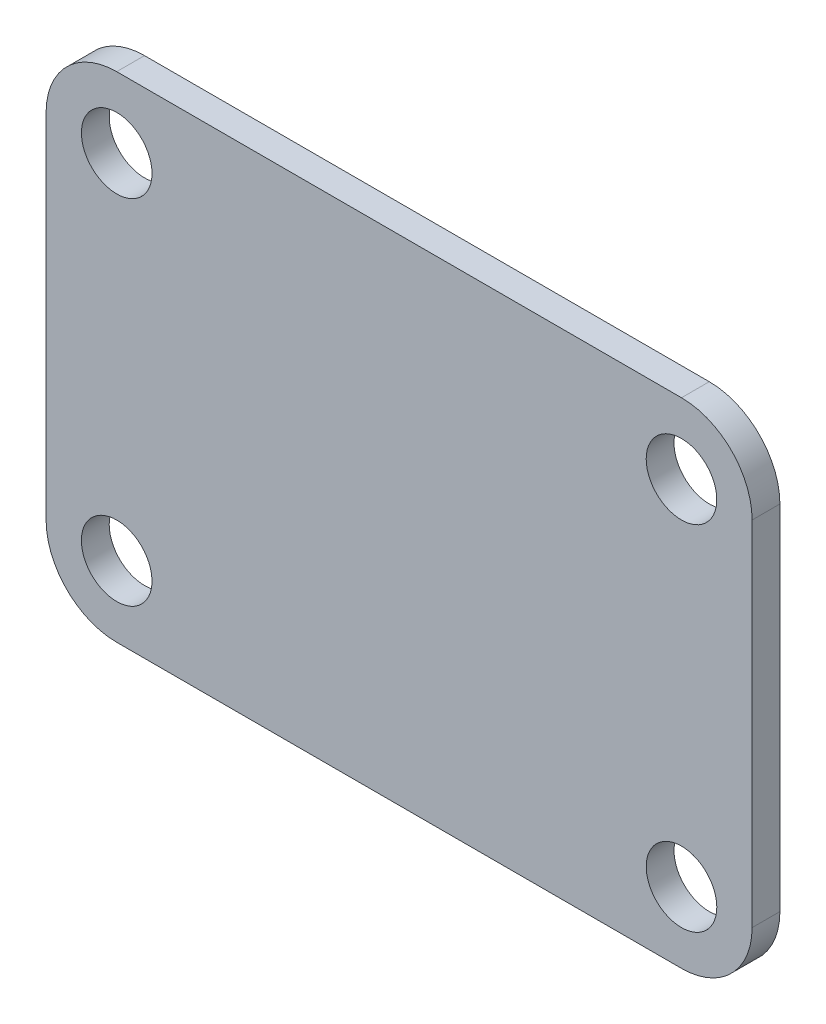
ISO-10303-21;
HEADER;
FILE_DESCRIPTION(('STEP AP214'),'2;1');
FILE_NAME('part.step','',(''),(''),'','','');
FILE_SCHEMA(('AUTOMOTIVE_DESIGN { 1 0 10303 214 1 1 1 1 }'));
ENDSEC;
DATA;
#1=APPLICATION_CONTEXT('core data for automotive mechanical design processes');
#2=APPLICATION_PROTOCOL_DEFINITION('international standard','automotive_design',2000,#1);
#3=PRODUCT_CONTEXT('',#1,'mechanical');
#4=PRODUCT('Part','Part','',(#3));
#5=PRODUCT_RELATED_PRODUCT_CATEGORY('part','',(#4));
#6=PRODUCT_DEFINITION_FORMATION('','',#4);
#7=PRODUCT_DEFINITION_CONTEXT('part definition',#1,'design');
#8=PRODUCT_DEFINITION('design','',#6,#7);
#9=PRODUCT_DEFINITION_SHAPE('','',#8);
#10=(LENGTH_UNIT() NAMED_UNIT(*) SI_UNIT(.MILLI.,.METRE.));
#11=(NAMED_UNIT(*) PLANE_ANGLE_UNIT() SI_UNIT($,.RADIAN.));
#12=(NAMED_UNIT(*) SI_UNIT($,.STERADIAN.) SOLID_ANGLE_UNIT());
#13=UNCERTAINTY_MEASURE_WITH_UNIT(LENGTH_MEASURE(1.E-05),#10,'distance_accuracy_value','');
#14=(GEOMETRIC_REPRESENTATION_CONTEXT(3) GLOBAL_UNCERTAINTY_ASSIGNED_CONTEXT((#13)) GLOBAL_UNIT_ASSIGNED_CONTEXT((#10,
#11,#12)) REPRESENTATION_CONTEXT('',''));
#15=CARTESIAN_POINT('',(0.,0.,0.));
#16=DIRECTION('',(0.,0.,1.));
#17=DIRECTION('',(1.,0.,0.));
#18=AXIS2_PLACEMENT_3D('',#15,#16,#17);
#19=CARTESIAN_POINT('',(10.16,-6.35,1.));
#20=DIRECTION('',(0.,0.,1.));
#21=DIRECTION('',(1.,0.,0.));
#22=AXIS2_PLACEMENT_3D('',#19,#20,#21);
#23=PLANE('',#22);
#24=CARTESIAN_POINT('',(10.16,-6.35,1.));
#25=DIRECTION('',(0.,0.,1.));
#26=DIRECTION('',(1.,0.,0.));
#27=AXIS2_PLACEMENT_3D('',#24,#25,#26);
#28=CIRCLE('',#27,1.27000000000001);
#29=CARTESIAN_POINT('',(11.43,-6.35,1.));
#30=VERTEX_POINT('',#29);
#31=EDGE_CURVE('E221',#30,#30,#28,.T.);
#32=ORIENTED_EDGE('',*,*,#31,.F.);
#33=EDGE_LOOP('',(#32));
#34=FACE_BOUND('',#33,.T.);
#35=CARTESIAN_POINT('',(-10.16,6.35,1.));
#36=DIRECTION('',(0.,0.,1.));
#37=DIRECTION('',(1.,0.,0.));
#38=AXIS2_PLACEMENT_3D('',#35,#36,#37);
#39=CIRCLE('',#38,1.27000000000001);
#40=CARTESIAN_POINT('',(-8.89,6.35,1.));
#41=VERTEX_POINT('',#40);
#42=EDGE_CURVE('E146',#41,#41,#39,.T.);
#43=ORIENTED_EDGE('',*,*,#42,.F.);
#44=EDGE_LOOP('',(#43));
#45=FACE_BOUND('',#44,.T.);
#46=CARTESIAN_POINT('',(10.16,-6.35,1.));
#47=DIRECTION('',(0.,0.,1.));
#48=DIRECTION('',(1.,0.,0.));
#49=AXIS2_PLACEMENT_3D('',#46,#47,#48);
#50=CIRCLE('',#49,2.54);
#51=CARTESIAN_POINT('',(10.16,-8.89,1.));
#52=VERTEX_POINT('',#51);
#53=CARTESIAN_POINT('',(12.7,-6.34999999999998,1.));
#54=VERTEX_POINT('',#53);
#55=EDGE_CURVE('E164',#52,#54,#50,.T.);
#56=ORIENTED_EDGE('',*,*,#55,.T.);
#57=DIRECTION('',(0.,1.,0.));
#58=VECTOR('',#57,1.);
#59=CARTESIAN_POINT('',(12.7,-6.34999999999998,1.));
#60=LINE('',#59,#58);
#61=CARTESIAN_POINT('',(12.7,6.34999999999998,1.));
#62=VERTEX_POINT('',#61);
#63=EDGE_CURVE('E100',#54,#62,#60,.T.);
#64=ORIENTED_EDGE('',*,*,#63,.T.);
#65=CARTESIAN_POINT('',(10.16,6.35,1.));
#66=DIRECTION('',(0.,0.,1.));
#67=DIRECTION('',(1.,0.,0.));
#68=AXIS2_PLACEMENT_3D('',#65,#66,#67);
#69=CIRCLE('',#68,2.54);
#70=CARTESIAN_POINT('',(10.16,8.89,1.));
#71=VERTEX_POINT('',#70);
#72=EDGE_CURVE('E185',#62,#71,#69,.T.);
#73=ORIENTED_EDGE('',*,*,#72,.T.);
#74=DIRECTION('',(-1.,0.,0.));
#75=VECTOR('',#74,1.);
#76=CARTESIAN_POINT('',(10.16,8.89,1.));
#77=LINE('',#76,#75);
#78=CARTESIAN_POINT('',(-10.16,8.89,1.));
#79=VERTEX_POINT('',#78);
#80=EDGE_CURVE('E199',#71,#79,#77,.T.);
#81=ORIENTED_EDGE('',*,*,#80,.T.);
#82=CARTESIAN_POINT('',(-10.16,6.35,1.));
#83=DIRECTION('',(0.,0.,1.));
#84=DIRECTION('',(1.,0.,0.));
#85=AXIS2_PLACEMENT_3D('',#82,#83,#84);
#86=CIRCLE('',#85,2.54);
#87=CARTESIAN_POINT('',(-12.7,6.34999999999998,1.));
#88=VERTEX_POINT('',#87);
#89=EDGE_CURVE('E119',#79,#88,#86,.T.);
#90=ORIENTED_EDGE('',*,*,#89,.T.);
#91=DIRECTION('',(0.,-1.,0.));
#92=VECTOR('',#91,1.);
#93=CARTESIAN_POINT('',(-12.7,-6.34999999999998,1.));
#94=LINE('',#93,#92);
#95=CARTESIAN_POINT('',(-12.7,-6.35,1.));
#96=VERTEX_POINT('',#95);
#97=EDGE_CURVE('E113',#88,#96,#94,.T.);
#98=ORIENTED_EDGE('',*,*,#97,.T.);
#99=CARTESIAN_POINT('',(-10.16,-6.35,1.));
#100=DIRECTION('',(0.,0.,1.));
#101=DIRECTION('',(-1.,0.,0.));
#102=AXIS2_PLACEMENT_3D('',#99,#100,#101);
#103=CIRCLE('',#102,2.54);
#104=CARTESIAN_POINT('',(-10.16,-8.89,1.));
#105=VERTEX_POINT('',#104);
#106=EDGE_CURVE('E117',#96,#105,#103,.T.);
#107=ORIENTED_EDGE('',*,*,#106,.T.);
#108=DIRECTION('',(1.,0.,0.));
#109=VECTOR('',#108,1.);
#110=CARTESIAN_POINT('',(10.16,-8.89,1.));
#111=LINE('',#110,#109);
#112=EDGE_CURVE('E57',#105,#52,#111,.T.);
#113=ORIENTED_EDGE('',*,*,#112,.T.);
#114=EDGE_LOOP('',(#56,#64,#73,#81,#90,#98,#107,#113));
#115=FACE_BOUND('',#114,.T.);
#116=CARTESIAN_POINT('',(10.16,6.35,1.));
#117=DIRECTION('',(0.,0.,1.));
#118=DIRECTION('',(-1.,0.,0.));
#119=AXIS2_PLACEMENT_3D('',#116,#117,#118);
#120=CIRCLE('',#119,1.27000000000001);
#121=CARTESIAN_POINT('',(8.88999999999998,6.35,1.));
#122=VERTEX_POINT('',#121);
#123=EDGE_CURVE('E213',#122,#122,#120,.T.);
#124=ORIENTED_EDGE('',*,*,#123,.F.);
#125=EDGE_LOOP('',(#124));
#126=FACE_BOUND('',#125,.T.);
#127=CARTESIAN_POINT('',(-10.16,-6.35000000000001,1.));
#128=DIRECTION('',(0.,0.,1.));
#129=DIRECTION('',(-1.,0.,0.));
#130=AXIS2_PLACEMENT_3D('',#127,#128,#129);
#131=CIRCLE('',#130,1.27);
#132=CARTESIAN_POINT('',(-11.43,-6.35000000000001,1.));
#133=VERTEX_POINT('',#132);
#134=EDGE_CURVE('E229',#133,#133,#131,.T.);
#135=ORIENTED_EDGE('',*,*,#134,.F.);
#136=EDGE_LOOP('',(#135));
#137=FACE_BOUND('',#136,.T.);
#138=ADVANCED_FACE('F39',(#34,#45,#115,#126,#137),#23,.T.);
#139=CARTESIAN_POINT('',(10.16,-6.35,0.));
#140=DIRECTION('',(0.,0.,1.));
#141=DIRECTION('',(1.,0.,0.));
#142=AXIS2_PLACEMENT_3D('',#139,#140,#141);
#143=PLANE('',#142);
#144=CARTESIAN_POINT('',(10.16,-6.35,0.));
#145=DIRECTION('',(0.,0.,1.));
#146=DIRECTION('',(1.,0.,0.));
#147=AXIS2_PLACEMENT_3D('',#144,#145,#146);
#148=CIRCLE('',#147,2.54);
#149=CARTESIAN_POINT('',(10.16,-8.89,0.));
#150=VERTEX_POINT('',#149);
#151=CARTESIAN_POINT('',(12.7,-6.34999999999998,0.));
#152=VERTEX_POINT('',#151);
#153=EDGE_CURVE('E141',#150,#152,#148,.T.);
#154=ORIENTED_EDGE('',*,*,#153,.F.);
#155=DIRECTION('',(1.,0.,0.));
#156=VECTOR('',#155,1.);
#157=CARTESIAN_POINT('',(10.16,-8.89,0.));
#158=LINE('',#157,#156);
#159=CARTESIAN_POINT('',(-10.16,-8.89,0.));
#160=VERTEX_POINT('',#159);
#161=EDGE_CURVE('E92',#160,#150,#158,.T.);
#162=ORIENTED_EDGE('',*,*,#161,.F.);
#163=CARTESIAN_POINT('',(-10.16,-6.35,0.));
#164=DIRECTION('',(0.,0.,1.));
#165=DIRECTION('',(-1.,0.,0.));
#166=AXIS2_PLACEMENT_3D('',#163,#164,#165);
#167=CIRCLE('',#166,2.54);
#168=CARTESIAN_POINT('',(-12.7,-6.35,0.));
#169=VERTEX_POINT('',#168);
#170=EDGE_CURVE('E86',#169,#160,#167,.T.);
#171=ORIENTED_EDGE('',*,*,#170,.F.);
#172=DIRECTION('',(0.,-1.,0.));
#173=VECTOR('',#172,1.);
#174=CARTESIAN_POINT('',(-12.7,-6.34999999999998,0.));
#175=LINE('',#174,#173);
#176=CARTESIAN_POINT('',(-12.7,6.34999999999998,0.));
#177=VERTEX_POINT('',#176);
#178=EDGE_CURVE('E128',#177,#169,#175,.T.);
#179=ORIENTED_EDGE('',*,*,#178,.F.);
#180=CARTESIAN_POINT('',(-10.16,6.35,0.));
#181=DIRECTION('',(0.,0.,1.));
#182=DIRECTION('',(1.,0.,0.));
#183=AXIS2_PLACEMENT_3D('',#180,#181,#182);
#184=CIRCLE('',#183,2.54);
#185=CARTESIAN_POINT('',(-10.16,8.89,0.));
#186=VERTEX_POINT('',#185);
#187=EDGE_CURVE('E155',#186,#177,#184,.T.);
#188=ORIENTED_EDGE('',*,*,#187,.F.);
#189=DIRECTION('',(-1.,0.,0.));
#190=VECTOR('',#189,1.);
#191=CARTESIAN_POINT('',(10.16,8.89,0.));
#192=LINE('',#191,#190);
#193=CARTESIAN_POINT('',(10.16,8.89,0.));
#194=VERTEX_POINT('',#193);
#195=EDGE_CURVE('E152',#194,#186,#192,.T.);
#196=ORIENTED_EDGE('',*,*,#195,.F.);
#197=CARTESIAN_POINT('',(10.16,6.35,0.));
#198=DIRECTION('',(0.,0.,1.));
#199=DIRECTION('',(1.,0.,0.));
#200=AXIS2_PLACEMENT_3D('',#197,#198,#199);
#201=CIRCLE('',#200,2.54);
#202=CARTESIAN_POINT('',(12.7,6.34999999999998,0.));
#203=VERTEX_POINT('',#202);
#204=EDGE_CURVE('E149',#203,#194,#201,.T.);
#205=ORIENTED_EDGE('',*,*,#204,.F.);
#206=DIRECTION('',(0.,1.,0.));
#207=VECTOR('',#206,1.);
#208=CARTESIAN_POINT('',(12.7,-6.34999999999998,0.));
#209=LINE('',#208,#207);
#210=EDGE_CURVE('E145',#152,#203,#209,.T.);
#211=ORIENTED_EDGE('',*,*,#210,.F.);
#212=EDGE_LOOP('',(#154,#162,#171,#179,#188,#196,#205,#211));
#213=FACE_BOUND('',#212,.T.);
#214=CARTESIAN_POINT('',(-10.16,6.35,0.));
#215=DIRECTION('',(0.,0.,1.));
#216=DIRECTION('',(1.,0.,0.));
#217=AXIS2_PLACEMENT_3D('',#214,#215,#216);
#218=CIRCLE('',#217,1.27000000000001);
#219=CARTESIAN_POINT('',(-8.89,6.35,0.));
#220=VERTEX_POINT('',#219);
#221=EDGE_CURVE('E209',#220,#220,#218,.T.);
#222=ORIENTED_EDGE('',*,*,#221,.T.);
#223=EDGE_LOOP('',(#222));
#224=FACE_BOUND('',#223,.T.);
#225=CARTESIAN_POINT('',(10.16,6.35,0.));
#226=DIRECTION('',(0.,0.,1.));
#227=DIRECTION('',(-1.,0.,0.));
#228=AXIS2_PLACEMENT_3D('',#225,#226,#227);
#229=CIRCLE('',#228,1.27000000000001);
#230=CARTESIAN_POINT('',(8.88999999999998,6.35,0.));
#231=VERTEX_POINT('',#230);
#232=EDGE_CURVE('E217',#231,#231,#229,.T.);
#233=ORIENTED_EDGE('',*,*,#232,.T.);
#234=EDGE_LOOP('',(#233));
#235=FACE_BOUND('',#234,.T.);
#236=CARTESIAN_POINT('',(10.16,-6.35,0.));
#237=DIRECTION('',(0.,0.,1.));
#238=DIRECTION('',(1.,0.,0.));
#239=AXIS2_PLACEMENT_3D('',#236,#237,#238);
#240=CIRCLE('',#239,1.27000000000001);
#241=CARTESIAN_POINT('',(11.43,-6.35,0.));
#242=VERTEX_POINT('',#241);
#243=EDGE_CURVE('E225',#242,#242,#240,.T.);
#244=ORIENTED_EDGE('',*,*,#243,.T.);
#245=EDGE_LOOP('',(#244));
#246=FACE_BOUND('',#245,.T.);
#247=CARTESIAN_POINT('',(-10.16,-6.35000000000001,0.));
#248=DIRECTION('',(0.,0.,1.));
#249=DIRECTION('',(-1.,0.,0.));
#250=AXIS2_PLACEMENT_3D('',#247,#248,#249);
#251=CIRCLE('',#250,1.27);
#252=CARTESIAN_POINT('',(-11.43,-6.35000000000001,0.));
#253=VERTEX_POINT('',#252);
#254=EDGE_CURVE('E233',#253,#253,#251,.T.);
#255=ORIENTED_EDGE('',*,*,#254,.T.);
#256=EDGE_LOOP('',(#255));
#257=FACE_BOUND('',#256,.T.);
#258=ADVANCED_FACE('F189',(#213,#224,#235,#246,#257),#143,.F.);
#259=CARTESIAN_POINT('',(10.16,-6.35,1.));
#260=DIRECTION('',(0.,0.,-1.));
#261=DIRECTION('',(-1.,0.,0.));
#262=AXIS2_PLACEMENT_3D('',#259,#260,#261);
#263=CYLINDRICAL_SURFACE('',#262,2.54);
#264=ORIENTED_EDGE('',*,*,#153,.T.);
#265=DIRECTION('',(0.,0.,-1.));
#266=VECTOR('',#265,1.);
#267=CARTESIAN_POINT('',(12.7,-6.34999999999998,1.));
#268=LINE('',#267,#266);
#269=EDGE_CURVE('E11',#54,#152,#268,.T.);
#270=ORIENTED_EDGE('',*,*,#269,.F.);
#271=ORIENTED_EDGE('',*,*,#55,.F.);
#272=DIRECTION('',(0.,0.,-1.));
#273=VECTOR('',#272,1.);
#274=CARTESIAN_POINT('',(10.16,-8.89,1.));
#275=LINE('',#274,#273);
#276=EDGE_CURVE('E137',#52,#150,#275,.T.);
#277=ORIENTED_EDGE('',*,*,#276,.T.);
#278=EDGE_LOOP('',(#264,#270,#271,#277));
#279=FACE_BOUND('',#278,.T.);
#280=ADVANCED_FACE('F41',(#279),#263,.T.);
#281=CARTESIAN_POINT('',(12.7,-6.34999999999998,1.));
#282=DIRECTION('',(-1.,0.,0.));
#283=DIRECTION('',(0.,0.,1.));
#284=AXIS2_PLACEMENT_3D('',#281,#282,#283);
#285=PLANE('',#284);
#286=ORIENTED_EDGE('',*,*,#210,.T.);
#287=DIRECTION('',(0.,0.,-1.));
#288=VECTOR('',#287,1.);
#289=CARTESIAN_POINT('',(12.7,6.34999999999998,1.));
#290=LINE('',#289,#288);
#291=EDGE_CURVE('E49',#62,#203,#290,.T.);
#292=ORIENTED_EDGE('',*,*,#291,.F.);
#293=ORIENTED_EDGE('',*,*,#63,.F.);
#294=ORIENTED_EDGE('',*,*,#269,.T.);
#295=EDGE_LOOP('',(#286,#292,#293,#294));
#296=FACE_BOUND('',#295,.T.);
#297=ADVANCED_FACE('F269',(#296),#285,.F.);
#298=CARTESIAN_POINT('',(10.16,6.35,1.));
#299=DIRECTION('',(0.,0.,-1.));
#300=DIRECTION('',(-1.,0.,0.));
#301=AXIS2_PLACEMENT_3D('',#298,#299,#300);
#302=CYLINDRICAL_SURFACE('',#301,2.54);
#303=ORIENTED_EDGE('',*,*,#204,.T.);
#304=DIRECTION('',(0.,0.,-1.));
#305=VECTOR('',#304,1.);
#306=CARTESIAN_POINT('',(10.16,8.89,1.));
#307=LINE('',#306,#305);
#308=EDGE_CURVE('E175',#71,#194,#307,.T.);
#309=ORIENTED_EDGE('',*,*,#308,.F.);
#310=ORIENTED_EDGE('',*,*,#72,.F.);
#311=ORIENTED_EDGE('',*,*,#291,.T.);
#312=EDGE_LOOP('',(#303,#309,#310,#311));
#313=FACE_BOUND('',#312,.T.);
#314=ADVANCED_FACE('F183',(#313),#302,.T.);
#315=CARTESIAN_POINT('',(10.16,8.89,1.));
#316=DIRECTION('',(0.,-1.,0.));
#317=DIRECTION('',(1.,0.,0.));
#318=AXIS2_PLACEMENT_3D('',#315,#316,#317);
#319=PLANE('',#318);
#320=ORIENTED_EDGE('',*,*,#195,.T.);
#321=DIRECTION('',(0.,0.,-1.));
#322=VECTOR('',#321,1.);
#323=CARTESIAN_POINT('',(-10.16,8.89,1.));
#324=LINE('',#323,#322);
#325=EDGE_CURVE('E171',#79,#186,#324,.T.);
#326=ORIENTED_EDGE('',*,*,#325,.F.);
#327=ORIENTED_EDGE('',*,*,#80,.F.);
#328=ORIENTED_EDGE('',*,*,#308,.T.);
#329=EDGE_LOOP('',(#320,#326,#327,#328));
#330=FACE_BOUND('',#329,.T.);
#331=ADVANCED_FACE('F194',(#330),#319,.F.);
#332=CARTESIAN_POINT('',(-10.16,6.35,1.));
#333=DIRECTION('',(0.,0.,-1.));
#334=DIRECTION('',(-1.,0.,0.));
#335=AXIS2_PLACEMENT_3D('',#332,#333,#334);
#336=CYLINDRICAL_SURFACE('',#335,2.54);
#337=ORIENTED_EDGE('',*,*,#187,.T.);
#338=DIRECTION('',(0.,0.,-1.));
#339=VECTOR('',#338,1.);
#340=CARTESIAN_POINT('',(-12.7,6.34999999999998,1.));
#341=LINE('',#340,#339);
#342=EDGE_CURVE('E130',#88,#177,#341,.T.);
#343=ORIENTED_EDGE('',*,*,#342,.F.);
#344=ORIENTED_EDGE('',*,*,#89,.F.);
#345=ORIENTED_EDGE('',*,*,#325,.T.);
#346=EDGE_LOOP('',(#337,#343,#344,#345));
#347=FACE_BOUND('',#346,.T.);
#348=ADVANCED_FACE('F197',(#347),#336,.T.);
#349=CARTESIAN_POINT('',(-12.7,-6.34999999999998,1.));
#350=DIRECTION('',(1.,0.,0.));
#351=DIRECTION('',(0.,0.,-1.));
#352=AXIS2_PLACEMENT_3D('',#349,#350,#351);
#353=PLANE('',#352);
#354=ORIENTED_EDGE('',*,*,#178,.T.);
#355=DIRECTION('',(0.,0.,-1.));
#356=VECTOR('',#355,1.);
#357=CARTESIAN_POINT('',(-12.7,-6.35,1.));
#358=LINE('',#357,#356);
#359=EDGE_CURVE('E125',#96,#169,#358,.T.);
#360=ORIENTED_EDGE('',*,*,#359,.F.);
#361=ORIENTED_EDGE('',*,*,#97,.F.);
#362=ORIENTED_EDGE('',*,*,#342,.T.);
#363=EDGE_LOOP('',(#354,#360,#361,#362));
#364=FACE_BOUND('',#363,.T.);
#365=ADVANCED_FACE('F126',(#364),#353,.F.);
#366=CARTESIAN_POINT('',(-10.16,-6.35,1.));
#367=DIRECTION('',(0.,0.,-1.));
#368=DIRECTION('',(-1.,0.,0.));
#369=AXIS2_PLACEMENT_3D('',#366,#367,#368);
#370=CYLINDRICAL_SURFACE('',#369,2.54);
#371=ORIENTED_EDGE('',*,*,#170,.T.);
#372=DIRECTION('',(0.,0.,-1.));
#373=VECTOR('',#372,1.);
#374=CARTESIAN_POINT('',(-10.16,-8.89,1.));
#375=LINE('',#374,#373);
#376=EDGE_CURVE('E131',#105,#160,#375,.T.);
#377=ORIENTED_EDGE('',*,*,#376,.F.);
#378=ORIENTED_EDGE('',*,*,#106,.F.);
#379=ORIENTED_EDGE('',*,*,#359,.T.);
#380=EDGE_LOOP('',(#371,#377,#378,#379));
#381=FACE_BOUND('',#380,.T.);
#382=ADVANCED_FACE('F133',(#381),#370,.T.);
#383=CARTESIAN_POINT('',(10.16,-8.89,1.));
#384=DIRECTION('',(0.,1.,0.));
#385=DIRECTION('',(-1.,0.,0.));
#386=AXIS2_PLACEMENT_3D('',#383,#384,#385);
#387=PLANE('',#386);
#388=ORIENTED_EDGE('',*,*,#161,.T.);
#389=ORIENTED_EDGE('',*,*,#276,.F.);
#390=ORIENTED_EDGE('',*,*,#112,.F.);
#391=ORIENTED_EDGE('',*,*,#376,.T.);
#392=EDGE_LOOP('',(#388,#389,#390,#391));
#393=FACE_BOUND('',#392,.T.);
#394=ADVANCED_FACE('F257',(#393),#387,.F.);
#395=CARTESIAN_POINT('',(-10.16,6.35,1.));
#396=DIRECTION('',(0.,0.,-1.));
#397=DIRECTION('',(-1.,0.,0.));
#398=AXIS2_PLACEMENT_3D('',#395,#396,#397);
#399=CYLINDRICAL_SURFACE('',#398,1.27000000000001);
#400=ORIENTED_EDGE('',*,*,#42,.T.);
#401=EDGE_LOOP('',(#400));
#402=FACE_BOUND('',#401,.T.);
#403=ORIENTED_EDGE('',*,*,#221,.F.);
#404=EDGE_LOOP('',(#403));
#405=FACE_BOUND('',#404,.T.);
#406=ADVANCED_FACE('F254',(#402,#405),#399,.F.);
#407=CARTESIAN_POINT('',(10.16,6.35,1.));
#408=DIRECTION('',(0.,0.,-1.));
#409=DIRECTION('',(-1.,0.,0.));
#410=AXIS2_PLACEMENT_3D('',#407,#408,#409);
#411=CYLINDRICAL_SURFACE('',#410,1.27000000000001);
#412=ORIENTED_EDGE('',*,*,#123,.T.);
#413=EDGE_LOOP('',(#412));
#414=FACE_BOUND('',#413,.T.);
#415=ORIENTED_EDGE('',*,*,#232,.F.);
#416=EDGE_LOOP('',(#415));
#417=FACE_BOUND('',#416,.T.);
#418=ADVANCED_FACE('F333',(#414,#417),#411,.F.);
#419=CARTESIAN_POINT('',(10.16,-6.35,1.));
#420=DIRECTION('',(0.,0.,-1.));
#421=DIRECTION('',(-1.,0.,0.));
#422=AXIS2_PLACEMENT_3D('',#419,#420,#421);
#423=CYLINDRICAL_SURFACE('',#422,1.27000000000001);
#424=ORIENTED_EDGE('',*,*,#31,.T.);
#425=EDGE_LOOP('',(#424));
#426=FACE_BOUND('',#425,.T.);
#427=ORIENTED_EDGE('',*,*,#243,.F.);
#428=EDGE_LOOP('',(#427));
#429=FACE_BOUND('',#428,.T.);
#430=ADVANCED_FACE('F341',(#426,#429),#423,.F.);
#431=CARTESIAN_POINT('',(-10.16,-6.35000000000001,1.));
#432=DIRECTION('',(0.,0.,-1.));
#433=DIRECTION('',(-1.,0.,0.));
#434=AXIS2_PLACEMENT_3D('',#431,#432,#433);
#435=CYLINDRICAL_SURFACE('',#434,1.27);
#436=ORIENTED_EDGE('',*,*,#134,.T.);
#437=EDGE_LOOP('',(#436));
#438=FACE_BOUND('',#437,.T.);
#439=ORIENTED_EDGE('',*,*,#254,.F.);
#440=EDGE_LOOP('',(#439));
#441=FACE_BOUND('',#440,.T.);
#442=ADVANCED_FACE('F241',(#438,#441),#435,.F.);
#443=CLOSED_SHELL('',(#138,#258,#280,#297,#314,#331,#348,#365,#382,#394,#406,#418,#430,#442));
#444=MANIFOLD_SOLID_BREP('B2',#443);
#445=ADVANCED_BREP_SHAPE_REPRESENTATION('',(#18,#444),#14);
#446=SHAPE_DEFINITION_REPRESENTATION(#9,#445);
ENDSEC;
END-ISO-10303-21;
